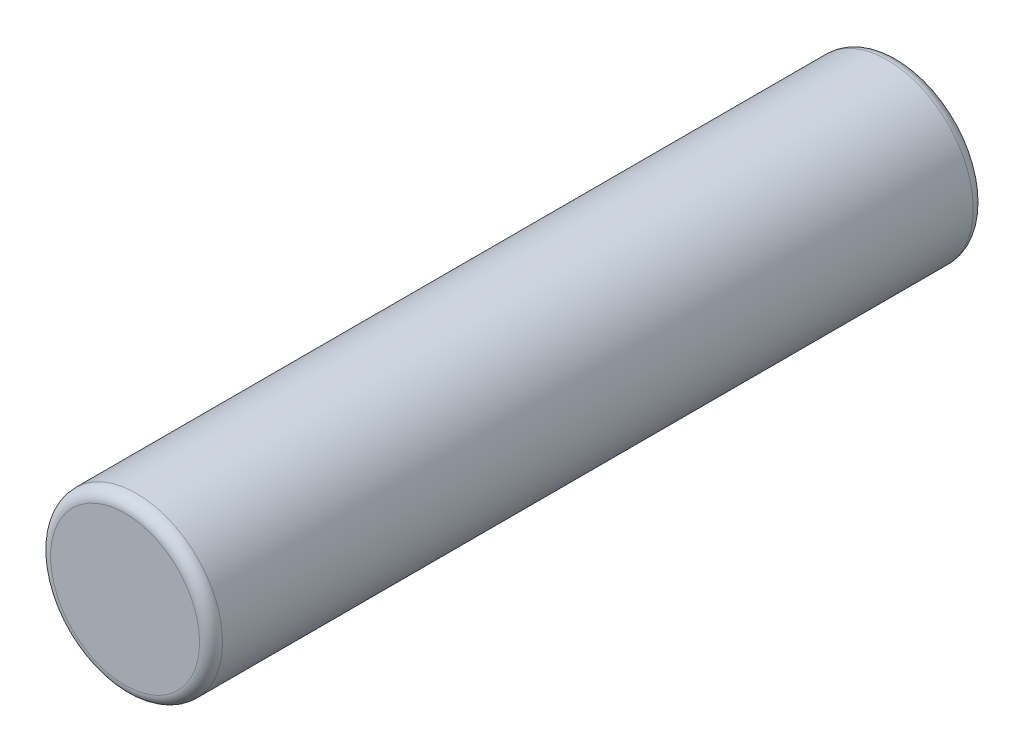
ISO-10303-21;
HEADER;
FILE_DESCRIPTION(('STEP AP214'),'2;1');
FILE_NAME('part.step','',(''),(''),'','','');
FILE_SCHEMA(('AUTOMOTIVE_DESIGN { 1 0 10303 214 1 1 1 1 }'));
ENDSEC;
DATA;
#1=APPLICATION_CONTEXT('core data for automotive mechanical design processes');
#2=APPLICATION_PROTOCOL_DEFINITION('international standard','automotive_design',2000,#1);
#3=PRODUCT_CONTEXT('',#1,'mechanical');
#4=PRODUCT('Part','Part','',(#3));
#5=PRODUCT_RELATED_PRODUCT_CATEGORY('part','',(#4));
#6=PRODUCT_DEFINITION_FORMATION('','',#4);
#7=PRODUCT_DEFINITION_CONTEXT('part definition',#1,'design');
#8=PRODUCT_DEFINITION('design','',#6,#7);
#9=PRODUCT_DEFINITION_SHAPE('','',#8);
#10=(LENGTH_UNIT() NAMED_UNIT(*) SI_UNIT(.MILLI.,.METRE.));
#11=(NAMED_UNIT(*) PLANE_ANGLE_UNIT() SI_UNIT($,.RADIAN.));
#12=(NAMED_UNIT(*) SI_UNIT($,.STERADIAN.) SOLID_ANGLE_UNIT());
#13=UNCERTAINTY_MEASURE_WITH_UNIT(LENGTH_MEASURE(1.E-05),#10,'distance_accuracy_value','');
#14=(GEOMETRIC_REPRESENTATION_CONTEXT(3) GLOBAL_UNCERTAINTY_ASSIGNED_CONTEXT((#13)) GLOBAL_UNIT_ASSIGNED_CONTEXT((#10,
#11,#12)) REPRESENTATION_CONTEXT('',''));
#15=CARTESIAN_POINT('',(0.,0.,0.));
#16=DIRECTION('',(0.,0.,1.));
#17=DIRECTION('',(1.,0.,0.));
#18=AXIS2_PLACEMENT_3D('',#15,#16,#17);
#19=CARTESIAN_POINT('',(0.,0.,13.5));
#20=DIRECTION('',(0.,0.,-1.));
#21=DIRECTION('',(-1.,0.,0.));
#22=AXIS2_PLACEMENT_3D('',#19,#20,#21);
#23=CYLINDRICAL_SURFACE('',#22,1.5);
#24=CARTESIAN_POINT('',(0.,0.,13.3));
#25=DIRECTION('',(0.,0.,1.));
#26=DIRECTION('',(1.,0.,0.));
#27=AXIS2_PLACEMENT_3D('',#24,#25,#26);
#28=CIRCLE('',#27,1.5);
#29=CARTESIAN_POINT('',(1.5,0.,13.3));
#30=VERTEX_POINT('',#29);
#31=EDGE_CURVE('E42',#30,#30,#28,.F.);
#32=ORIENTED_EDGE('',*,*,#31,.T.);
#33=EDGE_LOOP('',(#32));
#34=FACE_BOUND('',#33,.T.);
#35=CARTESIAN_POINT('',(0.,0.,0.200000000000001));
#36=DIRECTION('',(0.,0.,1.));
#37=DIRECTION('',(1.,0.,0.));
#38=AXIS2_PLACEMENT_3D('',#35,#36,#37);
#39=CIRCLE('',#38,1.5);
#40=CARTESIAN_POINT('',(1.5,0.,0.200000000000001));
#41=VERTEX_POINT('',#40);
#42=EDGE_CURVE('E46',#41,#41,#39,.T.);
#43=ORIENTED_EDGE('',*,*,#42,.T.);
#44=EDGE_LOOP('',(#43));
#45=FACE_BOUND('',#44,.T.);
#46=ADVANCED_FACE('F35',(#34,#45),#23,.T.);
#47=CARTESIAN_POINT('',(0.,0.,13.5));
#48=DIRECTION('',(0.,0.,1.));
#49=DIRECTION('',(1.,0.,0.));
#50=AXIS2_PLACEMENT_3D('',#47,#48,#49);
#51=PLANE('',#50);
#52=CARTESIAN_POINT('',(0.,0.,13.5));
#53=DIRECTION('',(0.,0.,1.));
#54=DIRECTION('',(1.,0.,0.));
#55=AXIS2_PLACEMENT_3D('',#52,#53,#54);
#56=CIRCLE('',#55,1.3);
#57=CARTESIAN_POINT('',(1.3,0.,13.5));
#58=VERTEX_POINT('',#57);
#59=EDGE_CURVE('E50',#58,#58,#56,.T.);
#60=ORIENTED_EDGE('',*,*,#59,.T.);
#61=EDGE_LOOP('',(#60));
#62=FACE_BOUND('',#61,.T.);
#63=ADVANCED_FACE('F56',(#62),#51,.T.);
#64=CARTESIAN_POINT('',(0.,0.,0.));
#65=DIRECTION('',(0.,0.,1.));
#66=DIRECTION('',(1.,0.,0.));
#67=AXIS2_PLACEMENT_3D('',#64,#65,#66);
#68=PLANE('',#67);
#69=CARTESIAN_POINT('',(0.,0.,0.));
#70=DIRECTION('',(0.,0.,1.));
#71=DIRECTION('',(1.,0.,0.));
#72=AXIS2_PLACEMENT_3D('',#69,#70,#71);
#73=CIRCLE('',#72,1.3);
#74=CARTESIAN_POINT('',(1.3,0.,0.));
#75=VERTEX_POINT('',#74);
#76=EDGE_CURVE('E10',#75,#75,#73,.F.);
#77=ORIENTED_EDGE('',*,*,#76,.T.);
#78=EDGE_LOOP('',(#77));
#79=FACE_BOUND('',#78,.T.);
#80=ADVANCED_FACE('F60',(#79),#68,.F.);
#81=CARTESIAN_POINT('',(0.,0.,13.3));
#82=DIRECTION('',(0.,0.,1.));
#83=DIRECTION('',(1.,0.,0.));
#84=AXIS2_PLACEMENT_3D('',#81,#82,#83);
#85=TOROIDAL_SURFACE('',#84,1.3,0.2);
#86=ORIENTED_EDGE('',*,*,#31,.F.);
#87=EDGE_LOOP('',(#86));
#88=FACE_BOUND('',#87,.T.);
#89=ORIENTED_EDGE('',*,*,#59,.F.);
#90=EDGE_LOOP('',(#89));
#91=FACE_BOUND('',#90,.T.);
#92=ADVANCED_FACE('F58',(#88,#91),#85,.T.);
#93=CARTESIAN_POINT('',(0.,0.,0.200000000000001));
#94=DIRECTION('',(0.,0.,1.));
#95=DIRECTION('',(1.,0.,0.));
#96=AXIS2_PLACEMENT_3D('',#93,#94,#95);
#97=TOROIDAL_SURFACE('',#96,1.3,0.2);
#98=ORIENTED_EDGE('',*,*,#76,.F.);
#99=EDGE_LOOP('',(#98));
#100=FACE_BOUND('',#99,.T.);
#101=ORIENTED_EDGE('',*,*,#42,.F.);
#102=EDGE_LOOP('',(#101));
#103=FACE_BOUND('',#102,.T.);
#104=ADVANCED_FACE('F37',(#100,#103),#97,.T.);
#105=CLOSED_SHELL('',(#46,#63,#80,#92,#104));
#106=MANIFOLD_SOLID_BREP('B2',#105);
#107=ADVANCED_BREP_SHAPE_REPRESENTATION('',(#18,#106),#14);
#108=SHAPE_DEFINITION_REPRESENTATION(#9,#107);
ENDSEC;
END-ISO-10303-21;
